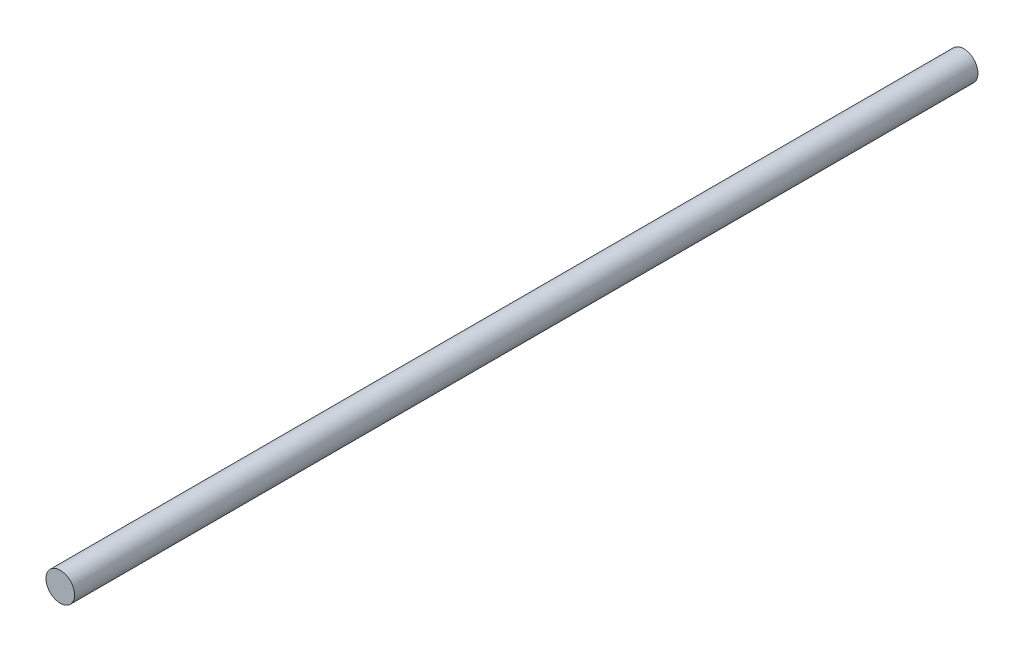
ISO-10303-21;
HEADER;
FILE_DESCRIPTION(('STEP AP214'),'2;1');
FILE_NAME('part.step','',(''),(''),'','','');
FILE_SCHEMA(('AUTOMOTIVE_DESIGN { 1 0 10303 214 1 1 1 1 }'));
ENDSEC;
DATA;
#1=APPLICATION_CONTEXT('core data for automotive mechanical design processes');
#2=APPLICATION_PROTOCOL_DEFINITION('international standard','automotive_design',2000,#1);
#3=PRODUCT_CONTEXT('',#1,'mechanical');
#4=PRODUCT('Part','Part','',(#3));
#5=PRODUCT_RELATED_PRODUCT_CATEGORY('part','',(#4));
#6=PRODUCT_DEFINITION_FORMATION('','',#4);
#7=PRODUCT_DEFINITION_CONTEXT('part definition',#1,'design');
#8=PRODUCT_DEFINITION('design','',#6,#7);
#9=PRODUCT_DEFINITION_SHAPE('','',#8);
#10=(LENGTH_UNIT() NAMED_UNIT(*) SI_UNIT(.MILLI.,.METRE.));
#11=(NAMED_UNIT(*) PLANE_ANGLE_UNIT() SI_UNIT($,.RADIAN.));
#12=(NAMED_UNIT(*) SI_UNIT($,.STERADIAN.) SOLID_ANGLE_UNIT());
#13=UNCERTAINTY_MEASURE_WITH_UNIT(LENGTH_MEASURE(1.E-05),#10,'distance_accuracy_value','');
#14=(GEOMETRIC_REPRESENTATION_CONTEXT(3) GLOBAL_UNCERTAINTY_ASSIGNED_CONTEXT((#13)) GLOBAL_UNIT_ASSIGNED_CONTEXT((#10,
#11,#12)) REPRESENTATION_CONTEXT('',''));
#15=CARTESIAN_POINT('',(0.,0.,0.));
#16=DIRECTION('',(0.,0.,1.));
#17=DIRECTION('',(1.,0.,0.));
#18=AXIS2_PLACEMENT_3D('',#15,#16,#17);
#19=CARTESIAN_POINT('',(-1.11544009940238E-13,26.,-252.5));
#20=DIRECTION('',(0.,0.,1.));
#21=DIRECTION('',(1.,0.,0.));
#22=AXIS2_PLACEMENT_3D('',#19,#20,#21);
#23=CYLINDRICAL_SURFACE('',#22,4.);
#24=CARTESIAN_POINT('',(-1.11544009940238E-13,26.,-252.5));
#25=DIRECTION('',(0.,0.,1.));
#26=DIRECTION('',(1.,0.,0.));
#27=AXIS2_PLACEMENT_3D('',#24,#25,#26);
#28=CIRCLE('',#27,4.);
#29=CARTESIAN_POINT('',(3.99999999999989,26.,-252.5));
#30=VERTEX_POINT('',#29);
#31=EDGE_CURVE('E10',#30,#30,#28,.T.);
#32=ORIENTED_EDGE('',*,*,#31,.T.);
#33=EDGE_LOOP('',(#32));
#34=FACE_BOUND('',#33,.T.);
#35=CARTESIAN_POINT('',(-1.11544009940238E-13,26.,0.));
#36=DIRECTION('',(0.,0.,1.));
#37=DIRECTION('',(1.,0.,0.));
#38=AXIS2_PLACEMENT_3D('',#35,#36,#37);
#39=CIRCLE('',#38,4.);
#40=CARTESIAN_POINT('',(3.99999999999989,26.,0.));
#41=VERTEX_POINT('',#40);
#42=EDGE_CURVE('E34',#41,#41,#39,.T.);
#43=ORIENTED_EDGE('',*,*,#42,.F.);
#44=EDGE_LOOP('',(#43));
#45=FACE_BOUND('',#44,.T.);
#46=ADVANCED_FACE('F31',(#34,#45),#23,.T.);
#47=CARTESIAN_POINT('',(-1.11544009940238E-13,26.,-252.5));
#48=DIRECTION('',(0.,0.,1.));
#49=DIRECTION('',(1.,0.,0.));
#50=AXIS2_PLACEMENT_3D('',#47,#48,#49);
#51=PLANE('',#50);
#52=ORIENTED_EDGE('',*,*,#31,.F.);
#53=EDGE_LOOP('',(#52));
#54=FACE_BOUND('',#53,.T.);
#55=ADVANCED_FACE('F46',(#54),#51,.F.);
#56=CARTESIAN_POINT('',(-1.11544009940238E-13,26.,0.));
#57=DIRECTION('',(0.,0.,1.));
#58=DIRECTION('',(1.,0.,0.));
#59=AXIS2_PLACEMENT_3D('',#56,#57,#58);
#60=PLANE('',#59);
#61=ORIENTED_EDGE('',*,*,#42,.T.);
#62=EDGE_LOOP('',(#61));
#63=FACE_BOUND('',#62,.T.);
#64=ADVANCED_FACE('F43',(#63),#60,.T.);
#65=CLOSED_SHELL('',(#46,#55,#64));
#66=MANIFOLD_SOLID_BREP('B2',#65);
#67=ADVANCED_BREP_SHAPE_REPRESENTATION('',(#18,#66),#14);
#68=SHAPE_DEFINITION_REPRESENTATION(#9,#67);
ENDSEC;
END-ISO-10303-21;
